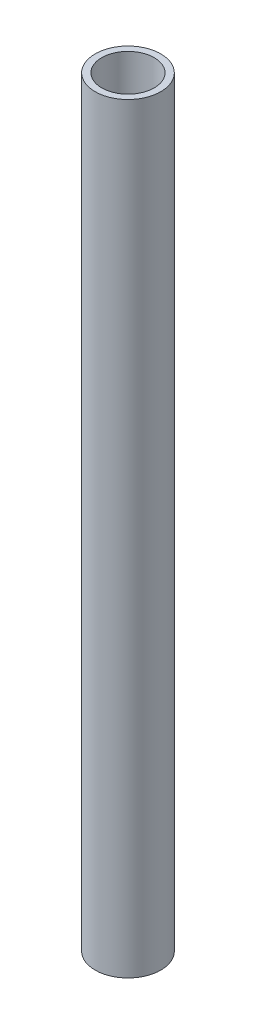
ISO-10303-21;
HEADER;
FILE_DESCRIPTION(('STEP AP214'),'2;1');
FILE_NAME('part.step','',(''),(''),'','','');
FILE_SCHEMA(('AUTOMOTIVE_DESIGN { 1 0 10303 214 1 1 1 1 }'));
ENDSEC;
DATA;
#1=APPLICATION_CONTEXT('core data for automotive mechanical design processes');
#2=APPLICATION_PROTOCOL_DEFINITION('international standard','automotive_design',2000,#1);
#3=PRODUCT_CONTEXT('',#1,'mechanical');
#4=PRODUCT('Part','Part','',(#3));
#5=PRODUCT_RELATED_PRODUCT_CATEGORY('part','',(#4));
#6=PRODUCT_DEFINITION_FORMATION('','',#4);
#7=PRODUCT_DEFINITION_CONTEXT('part definition',#1,'design');
#8=PRODUCT_DEFINITION('design','',#6,#7);
#9=PRODUCT_DEFINITION_SHAPE('','',#8);
#10=(LENGTH_UNIT() NAMED_UNIT(*) SI_UNIT(.MILLI.,.METRE.));
#11=(NAMED_UNIT(*) PLANE_ANGLE_UNIT() SI_UNIT($,.RADIAN.));
#12=(NAMED_UNIT(*) SI_UNIT($,.STERADIAN.) SOLID_ANGLE_UNIT());
#13=UNCERTAINTY_MEASURE_WITH_UNIT(LENGTH_MEASURE(1.E-05),#10,'distance_accuracy_value','');
#14=(GEOMETRIC_REPRESENTATION_CONTEXT(3) GLOBAL_UNCERTAINTY_ASSIGNED_CONTEXT((#13)) GLOBAL_UNIT_ASSIGNED_CONTEXT((#10,
#11,#12)) REPRESENTATION_CONTEXT('',''));
#15=CARTESIAN_POINT('',(0.,0.,0.));
#16=DIRECTION('',(0.,0.,1.));
#17=DIRECTION('',(1.,0.,0.));
#18=AXIS2_PLACEMENT_3D('',#15,#16,#17);
#19=CARTESIAN_POINT('',(0.,368.3,0.));
#20=DIRECTION('',(0.,1.,0.));
#21=DIRECTION('',(0.,0.,1.));
#22=AXIS2_PLACEMENT_3D('',#19,#20,#21);
#23=PLANE('',#22);
#24=CARTESIAN_POINT('',(0.,368.3,0.));
#25=DIRECTION('',(0.,1.,0.));
#26=DIRECTION('',(0.,0.,1.));
#27=AXIS2_PLACEMENT_3D('',#24,#25,#26);
#28=CIRCLE('',#27,15.875);
#29=CARTESIAN_POINT('',(0.,368.3,15.875));
#30=VERTEX_POINT('',#29);
#31=EDGE_CURVE('E10',#30,#30,#28,.T.);
#32=ORIENTED_EDGE('',*,*,#31,.T.);
#33=EDGE_LOOP('',(#32));
#34=FACE_BOUND('',#33,.T.);
#35=CARTESIAN_POINT('',(0.,368.3,0.));
#36=DIRECTION('',(0.,1.,0.));
#37=DIRECTION('',(0.,0.,1.));
#38=AXIS2_PLACEMENT_3D('',#35,#36,#37);
#39=CIRCLE('',#38,12.7);
#40=CARTESIAN_POINT('',(0.,368.3,12.7));
#41=VERTEX_POINT('',#40);
#42=EDGE_CURVE('E41',#41,#41,#39,.T.);
#43=ORIENTED_EDGE('',*,*,#42,.F.);
#44=EDGE_LOOP('',(#43));
#45=FACE_BOUND('',#44,.T.);
#46=ADVANCED_FACE('F30',(#34,#45),#23,.T.);
#47=CARTESIAN_POINT('',(0.,0.,0.));
#48=DIRECTION('',(0.,1.,0.));
#49=DIRECTION('',(0.,0.,1.));
#50=AXIS2_PLACEMENT_3D('',#47,#48,#49);
#51=PLANE('',#50);
#52=CARTESIAN_POINT('',(0.,0.,0.));
#53=DIRECTION('',(0.,1.,0.));
#54=DIRECTION('',(0.,0.,1.));
#55=AXIS2_PLACEMENT_3D('',#52,#53,#54);
#56=CIRCLE('',#55,15.875);
#57=CARTESIAN_POINT('',(0.,0.,15.875));
#58=VERTEX_POINT('',#57);
#59=EDGE_CURVE('E34',#58,#58,#56,.T.);
#60=ORIENTED_EDGE('',*,*,#59,.F.);
#61=EDGE_LOOP('',(#60));
#62=FACE_BOUND('',#61,.T.);
#63=CARTESIAN_POINT('',(0.,0.,0.));
#64=DIRECTION('',(0.,1.,0.));
#65=DIRECTION('',(0.,0.,1.));
#66=AXIS2_PLACEMENT_3D('',#63,#64,#65);
#67=CIRCLE('',#66,12.7);
#68=CARTESIAN_POINT('',(0.,0.,12.7));
#69=VERTEX_POINT('',#68);
#70=EDGE_CURVE('E43',#69,#69,#67,.T.);
#71=ORIENTED_EDGE('',*,*,#70,.T.);
#72=EDGE_LOOP('',(#71));
#73=FACE_BOUND('',#72,.T.);
#74=ADVANCED_FACE('F53',(#62,#73),#51,.F.);
#75=CARTESIAN_POINT('',(0.,368.3,0.));
#76=DIRECTION('',(0.,-1.,0.));
#77=DIRECTION('',(0.,0.,-1.));
#78=AXIS2_PLACEMENT_3D('',#75,#76,#77);
#79=CYLINDRICAL_SURFACE('',#78,15.875);
#80=ORIENTED_EDGE('',*,*,#31,.F.);
#81=EDGE_LOOP('',(#80));
#82=FACE_BOUND('',#81,.T.);
#83=ORIENTED_EDGE('',*,*,#59,.T.);
#84=EDGE_LOOP('',(#83));
#85=FACE_BOUND('',#84,.T.);
#86=ADVANCED_FACE('F32',(#82,#85),#79,.T.);
#87=CARTESIAN_POINT('',(0.,368.3,0.));
#88=DIRECTION('',(0.,-1.,0.));
#89=DIRECTION('',(0.,0.,-1.));
#90=AXIS2_PLACEMENT_3D('',#87,#88,#89);
#91=CYLINDRICAL_SURFACE('',#90,12.7);
#92=ORIENTED_EDGE('',*,*,#42,.T.);
#93=EDGE_LOOP('',(#92));
#94=FACE_BOUND('',#93,.T.);
#95=ORIENTED_EDGE('',*,*,#70,.F.);
#96=EDGE_LOOP('',(#95));
#97=FACE_BOUND('',#96,.T.);
#98=ADVANCED_FACE('F49',(#94,#97),#91,.F.);
#99=CLOSED_SHELL('',(#46,#74,#86,#98));
#100=MANIFOLD_SOLID_BREP('B2',#99);
#101=ADVANCED_BREP_SHAPE_REPRESENTATION('',(#18,#100),#14);
#102=SHAPE_DEFINITION_REPRESENTATION(#9,#101);
ENDSEC;
END-ISO-10303-21;
